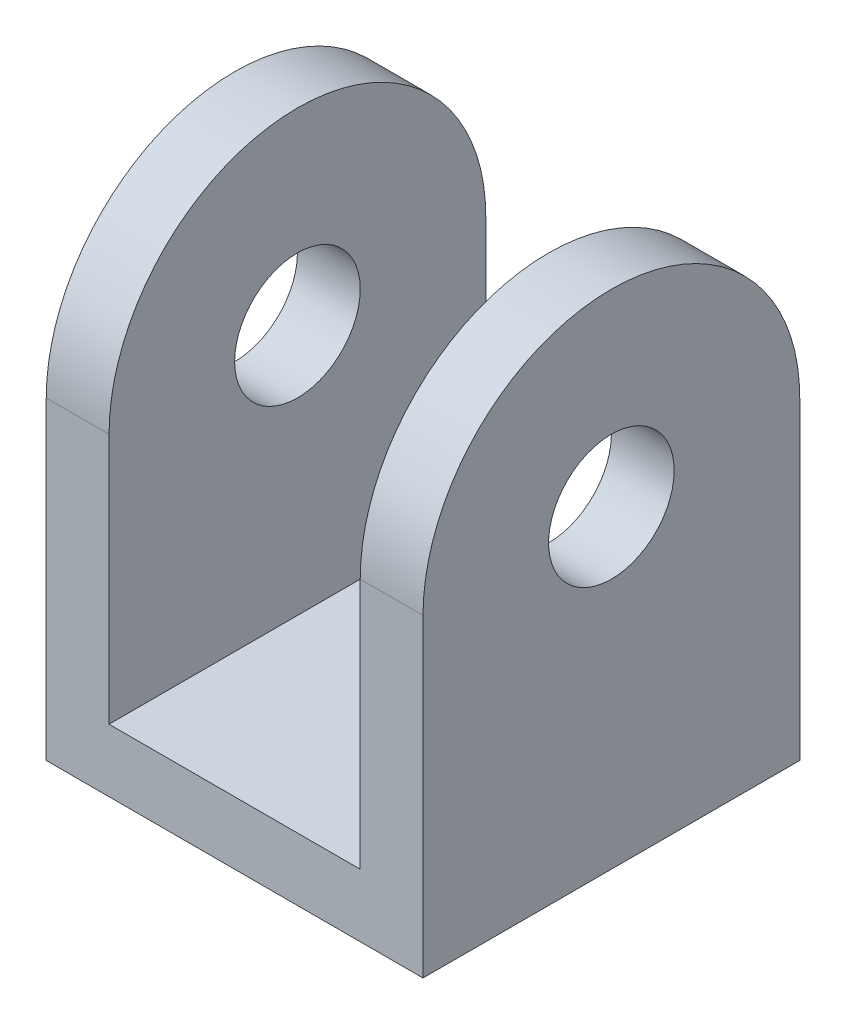
ISO-10303-21;
HEADER;
FILE_DESCRIPTION(('STEP AP214'),'2;1');
FILE_NAME('part.step','',(''),(''),'','','');
FILE_SCHEMA(('AUTOMOTIVE_DESIGN { 1 0 10303 214 1 1 1 1 }'));
ENDSEC;
DATA;
#1=APPLICATION_CONTEXT('core data for automotive mechanical design processes');
#2=APPLICATION_PROTOCOL_DEFINITION('international standard','automotive_design',2000,#1);
#3=PRODUCT_CONTEXT('',#1,'mechanical');
#4=PRODUCT('Part','Part','',(#3));
#5=PRODUCT_RELATED_PRODUCT_CATEGORY('part','',(#4));
#6=PRODUCT_DEFINITION_FORMATION('','',#4);
#7=PRODUCT_DEFINITION_CONTEXT('part definition',#1,'design');
#8=PRODUCT_DEFINITION('design','',#6,#7);
#9=PRODUCT_DEFINITION_SHAPE('','',#8);
#10=(LENGTH_UNIT() NAMED_UNIT(*) SI_UNIT(.MILLI.,.METRE.));
#11=(NAMED_UNIT(*) PLANE_ANGLE_UNIT() SI_UNIT($,.RADIAN.));
#12=(NAMED_UNIT(*) SI_UNIT($,.STERADIAN.) SOLID_ANGLE_UNIT());
#13=UNCERTAINTY_MEASURE_WITH_UNIT(LENGTH_MEASURE(1.E-05),#10,'distance_accuracy_value','');
#14=(GEOMETRIC_REPRESENTATION_CONTEXT(3) GLOBAL_UNCERTAINTY_ASSIGNED_CONTEXT((#13)) GLOBAL_UNIT_ASSIGNED_CONTEXT((#10,
#11,#12)) REPRESENTATION_CONTEXT('',''));
#15=CARTESIAN_POINT('',(0.,0.,0.));
#16=DIRECTION('',(0.,0.,1.));
#17=DIRECTION('',(1.,0.,0.));
#18=AXIS2_PLACEMENT_3D('',#15,#16,#17);
#19=CARTESIAN_POINT('',(0.,50.,30.));
#20=DIRECTION('',(1.,0.,0.));
#21=DIRECTION('',(0.,0.,-1.));
#22=AXIS2_PLACEMENT_3D('',#19,#20,#21);
#23=CYLINDRICAL_SURFACE('',#22,10.);
#24=CARTESIAN_POINT('',(10.,50.,30.));
#25=DIRECTION('',(-1.,0.,0.));
#26=DIRECTION('',(0.,0.,1.));
#27=AXIS2_PLACEMENT_3D('',#24,#25,#26);
#28=CIRCLE('',#27,10.);
#29=CARTESIAN_POINT('',(10.,50.,40.));
#30=VERTEX_POINT('',#29);
#31=EDGE_CURVE('E174',#30,#30,#28,.F.);
#32=ORIENTED_EDGE('',*,*,#31,.T.);
#33=EDGE_LOOP('',(#32));
#34=FACE_BOUND('',#33,.T.);
#35=CARTESIAN_POINT('',(0.,50.,30.));
#36=DIRECTION('',(1.,0.,0.));
#37=DIRECTION('',(0.,0.,-1.));
#38=AXIS2_PLACEMENT_3D('',#35,#36,#37);
#39=CIRCLE('',#38,10.);
#40=CARTESIAN_POINT('',(0.,50.,20.));
#41=VERTEX_POINT('',#40);
#42=EDGE_CURVE('E125',#41,#41,#39,.T.);
#43=ORIENTED_EDGE('',*,*,#42,.F.);
#44=EDGE_LOOP('',(#43));
#45=FACE_BOUND('',#44,.T.);
#46=ADVANCED_FACE('F33',(#34,#45),#23,.F.);
#47=CARTESIAN_POINT('',(60.,50.,30.));
#48=DIRECTION('',(-1.,0.,0.));
#49=DIRECTION('',(0.,0.,1.));
#50=AXIS2_PLACEMENT_3D('',#47,#48,#49);
#51=CYLINDRICAL_SURFACE('',#50,30.);
#52=CARTESIAN_POINT('',(10.,50.,30.));
#53=DIRECTION('',(-1.,0.,0.));
#54=DIRECTION('',(0.,0.,1.));
#55=AXIS2_PLACEMENT_3D('',#52,#53,#54);
#56=CIRCLE('',#55,30.);
#57=CARTESIAN_POINT('',(10.,50.,60.));
#58=VERTEX_POINT('',#57);
#59=CARTESIAN_POINT('',(10.,50.,0.));
#60=VERTEX_POINT('',#59);
#61=EDGE_CURVE('E11',#58,#60,#56,.T.);
#62=ORIENTED_EDGE('',*,*,#61,.T.);
#63=DIRECTION('',(-1.,0.,0.));
#64=VECTOR('',#63,1.);
#65=CARTESIAN_POINT('',(10.,50.,0.));
#66=LINE('',#65,#64);
#67=CARTESIAN_POINT('',(0.,50.,0.));
#68=VERTEX_POINT('',#67);
#69=EDGE_CURVE('E136',#60,#68,#66,.T.);
#70=ORIENTED_EDGE('',*,*,#69,.T.);
#71=CARTESIAN_POINT('',(0.,50.,30.));
#72=DIRECTION('',(1.,0.,0.));
#73=DIRECTION('',(0.,0.,-1.));
#74=AXIS2_PLACEMENT_3D('',#71,#72,#73);
#75=CIRCLE('',#74,30.);
#76=CARTESIAN_POINT('',(0.,50.,60.));
#77=VERTEX_POINT('',#76);
#78=EDGE_CURVE('E171',#68,#77,#75,.T.);
#79=ORIENTED_EDGE('',*,*,#78,.T.);
#80=DIRECTION('',(-1.,0.,0.));
#81=VECTOR('',#80,1.);
#82=CARTESIAN_POINT('',(10.,50.,60.));
#83=LINE('',#82,#81);
#84=EDGE_CURVE('E50',#58,#77,#83,.T.);
#85=ORIENTED_EDGE('',*,*,#84,.F.);
#86=EDGE_LOOP('',(#62,#70,#79,#85));
#87=FACE_BOUND('',#86,.T.);
#88=ADVANCED_FACE('F185',(#87),#51,.T.);
#89=CARTESIAN_POINT('',(50.,50.,60.));
#90=DIRECTION('',(1.,0.,0.));
#91=DIRECTION('',(0.,1.,0.));
#92=AXIS2_PLACEMENT_3D('',#89,#90,#91);
#93=PLANE('',#92);
#94=DIRECTION('',(0.,-1.,0.));
#95=VECTOR('',#94,1.);
#96=CARTESIAN_POINT('',(50.,50.,60.));
#97=LINE('',#96,#95);
#98=CARTESIAN_POINT('',(50.,50.,60.));
#99=VERTEX_POINT('',#98);
#100=CARTESIAN_POINT('',(50.,9.99999999999999,60.));
#101=VERTEX_POINT('',#100);
#102=EDGE_CURVE('E106',#99,#101,#97,.T.);
#103=ORIENTED_EDGE('',*,*,#102,.F.);
#104=CARTESIAN_POINT('',(50.,50.,30.));
#105=DIRECTION('',(1.,0.,0.));
#106=DIRECTION('',(0.,0.,-1.));
#107=AXIS2_PLACEMENT_3D('',#104,#105,#106);
#108=CIRCLE('',#107,30.);
#109=CARTESIAN_POINT('',(50.,50.,0.));
#110=VERTEX_POINT('',#109);
#111=EDGE_CURVE('E42',#110,#99,#108,.T.);
#112=ORIENTED_EDGE('',*,*,#111,.F.);
#113=DIRECTION('',(0.,-1.,0.));
#114=VECTOR('',#113,1.);
#115=CARTESIAN_POINT('',(50.,50.,0.));
#116=LINE('',#115,#114);
#117=CARTESIAN_POINT('',(50.,9.99999999999999,0.));
#118=VERTEX_POINT('',#117);
#119=EDGE_CURVE('E72',#110,#118,#116,.T.);
#120=ORIENTED_EDGE('',*,*,#119,.T.);
#121=DIRECTION('',(0.,0.,-1.));
#122=VECTOR('',#121,1.);
#123=CARTESIAN_POINT('',(50.,9.99999999999999,60.));
#124=LINE('',#123,#122);
#125=EDGE_CURVE('E113',#101,#118,#124,.T.);
#126=ORIENTED_EDGE('',*,*,#125,.F.);
#127=EDGE_LOOP('',(#103,#112,#120,#126));
#128=FACE_BOUND('',#127,.T.);
#129=CARTESIAN_POINT('',(50.,50.,30.));
#130=DIRECTION('',(1.,0.,0.));
#131=DIRECTION('',(0.,0.,-1.));
#132=AXIS2_PLACEMENT_3D('',#129,#130,#131);
#133=CIRCLE('',#132,10.);
#134=CARTESIAN_POINT('',(50.,50.,20.));
#135=VERTEX_POINT('',#134);
#136=EDGE_CURVE('E178',#135,#135,#133,.F.);
#137=ORIENTED_EDGE('',*,*,#136,.F.);
#138=EDGE_LOOP('',(#137));
#139=FACE_BOUND('',#138,.T.);
#140=ADVANCED_FACE('F159',(#128,#139),#93,.F.);
#141=CARTESIAN_POINT('',(10.,9.99999999999999,60.));
#142=DIRECTION('',(-1.,0.,0.));
#143=DIRECTION('',(0.,-1.,0.));
#144=AXIS2_PLACEMENT_3D('',#141,#142,#143);
#145=PLANE('',#144);
#146=DIRECTION('',(0.,1.,0.));
#147=VECTOR('',#146,1.);
#148=CARTESIAN_POINT('',(10.,9.99999999999999,0.));
#149=LINE('',#148,#147);
#150=CARTESIAN_POINT('',(10.,9.99999999999999,0.));
#151=VERTEX_POINT('',#150);
#152=EDGE_CURVE('E134',#151,#60,#149,.T.);
#153=ORIENTED_EDGE('',*,*,#152,.T.);
#154=ORIENTED_EDGE('',*,*,#61,.F.);
#155=DIRECTION('',(0.,1.,0.));
#156=VECTOR('',#155,1.);
#157=CARTESIAN_POINT('',(10.,9.99999999999999,60.));
#158=LINE('',#157,#156);
#159=CARTESIAN_POINT('',(10.,9.99999999999999,60.));
#160=VERTEX_POINT('',#159);
#161=EDGE_CURVE('E103',#160,#58,#158,.T.);
#162=ORIENTED_EDGE('',*,*,#161,.F.);
#163=DIRECTION('',(0.,0.,-1.));
#164=VECTOR('',#163,1.);
#165=CARTESIAN_POINT('',(10.,9.99999999999999,60.));
#166=LINE('',#165,#164);
#167=EDGE_CURVE('E108',#160,#151,#166,.T.);
#168=ORIENTED_EDGE('',*,*,#167,.T.);
#169=EDGE_LOOP('',(#153,#154,#162,#168));
#170=FACE_BOUND('',#169,.T.);
#171=ORIENTED_EDGE('',*,*,#31,.F.);
#172=EDGE_LOOP('',(#171));
#173=FACE_BOUND('',#172,.T.);
#174=ADVANCED_FACE('F115',(#170,#173),#145,.F.);
#175=CARTESIAN_POINT('',(0.,50.,60.));
#176=DIRECTION('',(1.,0.,0.));
#177=DIRECTION('',(0.,0.,-1.));
#178=AXIS2_PLACEMENT_3D('',#175,#176,#177);
#179=PLANE('',#178);
#180=ORIENTED_EDGE('',*,*,#78,.F.);
#181=DIRECTION('',(0.,-1.,0.));
#182=VECTOR('',#181,1.);
#183=CARTESIAN_POINT('',(0.,50.,0.));
#184=LINE('',#183,#182);
#185=CARTESIAN_POINT('',(0.,0.,0.));
#186=VERTEX_POINT('',#185);
#187=EDGE_CURVE('E121',#68,#186,#184,.T.);
#188=ORIENTED_EDGE('',*,*,#187,.T.);
#189=DIRECTION('',(0.,0.,-1.));
#190=VECTOR('',#189,1.);
#191=CARTESIAN_POINT('',(0.,0.,60.));
#192=LINE('',#191,#190);
#193=CARTESIAN_POINT('',(0.,0.,60.));
#194=VERTEX_POINT('',#193);
#195=EDGE_CURVE('E144',#194,#186,#192,.T.);
#196=ORIENTED_EDGE('',*,*,#195,.F.);
#197=DIRECTION('',(0.,-1.,0.));
#198=VECTOR('',#197,1.);
#199=CARTESIAN_POINT('',(0.,50.,60.));
#200=LINE('',#199,#198);
#201=EDGE_CURVE('E138',#77,#194,#200,.T.);
#202=ORIENTED_EDGE('',*,*,#201,.F.);
#203=EDGE_LOOP('',(#180,#188,#196,#202));
#204=FACE_BOUND('',#203,.T.);
#205=ORIENTED_EDGE('',*,*,#42,.T.);
#206=EDGE_LOOP('',(#205));
#207=FACE_BOUND('',#206,.T.);
#208=ADVANCED_FACE('F35',(#204,#207),#179,.F.);
#209=CARTESIAN_POINT('',(0.,0.,60.));
#210=DIRECTION('',(0.,1.,0.));
#211=DIRECTION('',(0.,0.,1.));
#212=AXIS2_PLACEMENT_3D('',#209,#210,#211);
#213=PLANE('',#212);
#214=DIRECTION('',(1.,0.,0.));
#215=VECTOR('',#214,1.);
#216=CARTESIAN_POINT('',(0.,0.,0.));
#217=LINE('',#216,#215);
#218=CARTESIAN_POINT('',(60.,0.,0.));
#219=VERTEX_POINT('',#218);
#220=EDGE_CURVE('E124',#186,#219,#217,.T.);
#221=ORIENTED_EDGE('',*,*,#220,.T.);
#222=DIRECTION('',(0.,0.,-1.));
#223=VECTOR('',#222,1.);
#224=CARTESIAN_POINT('',(60.,0.,60.));
#225=LINE('',#224,#223);
#226=CARTESIAN_POINT('',(60.,0.,60.));
#227=VERTEX_POINT('',#226);
#228=EDGE_CURVE('E141',#227,#219,#225,.T.);
#229=ORIENTED_EDGE('',*,*,#228,.F.);
#230=DIRECTION('',(1.,0.,0.));
#231=VECTOR('',#230,1.);
#232=CARTESIAN_POINT('',(0.,0.,60.));
#233=LINE('',#232,#231);
#234=EDGE_CURVE('E88',#194,#227,#233,.T.);
#235=ORIENTED_EDGE('',*,*,#234,.F.);
#236=ORIENTED_EDGE('',*,*,#195,.T.);
#237=EDGE_LOOP('',(#221,#229,#235,#236));
#238=FACE_BOUND('',#237,.T.);
#239=ADVANCED_FACE('F220',(#238),#213,.F.);
#240=CARTESIAN_POINT('',(60.,0.,60.));
#241=DIRECTION('',(-1.,0.,0.));
#242=DIRECTION('',(0.,0.,1.));
#243=AXIS2_PLACEMENT_3D('',#240,#241,#242);
#244=PLANE('',#243);
#245=DIRECTION('',(0.,1.,0.));
#246=VECTOR('',#245,1.);
#247=CARTESIAN_POINT('',(60.,0.,0.));
#248=LINE('',#247,#246);
#249=CARTESIAN_POINT('',(60.,50.,0.));
#250=VERTEX_POINT('',#249);
#251=EDGE_CURVE('E127',#219,#250,#248,.T.);
#252=ORIENTED_EDGE('',*,*,#251,.T.);
#253=CARTESIAN_POINT('',(60.,50.,30.));
#254=DIRECTION('',(1.,0.,0.));
#255=DIRECTION('',(0.,0.,-1.));
#256=AXIS2_PLACEMENT_3D('',#253,#254,#255);
#257=CIRCLE('',#256,30.);
#258=CARTESIAN_POINT('',(60.,50.,60.));
#259=VERTEX_POINT('',#258);
#260=EDGE_CURVE('E168',#250,#259,#257,.T.);
#261=ORIENTED_EDGE('',*,*,#260,.T.);
#262=DIRECTION('',(0.,1.,0.));
#263=VECTOR('',#262,1.);
#264=CARTESIAN_POINT('',(60.,0.,60.));
#265=LINE('',#264,#263);
#266=EDGE_CURVE('E157',#227,#259,#265,.T.);
#267=ORIENTED_EDGE('',*,*,#266,.F.);
#268=ORIENTED_EDGE('',*,*,#228,.T.);
#269=EDGE_LOOP('',(#252,#261,#267,#268));
#270=FACE_BOUND('',#269,.T.);
#271=CARTESIAN_POINT('',(60.,50.,30.));
#272=DIRECTION('',(1.,0.,0.));
#273=DIRECTION('',(0.,0.,-1.));
#274=AXIS2_PLACEMENT_3D('',#271,#272,#273);
#275=CIRCLE('',#274,10.);
#276=CARTESIAN_POINT('',(60.,50.,20.));
#277=VERTEX_POINT('',#276);
#278=EDGE_CURVE('E165',#277,#277,#275,.T.);
#279=ORIENTED_EDGE('',*,*,#278,.F.);
#280=EDGE_LOOP('',(#279));
#281=FACE_BOUND('',#280,.T.);
#282=ADVANCED_FACE('F216',(#270,#281),#244,.F.);
#283=CARTESIAN_POINT('',(50.,9.99999999999999,60.));
#284=DIRECTION('',(0.,-1.,0.));
#285=DIRECTION('',(1.,0.,0.));
#286=AXIS2_PLACEMENT_3D('',#283,#284,#285);
#287=PLANE('',#286);
#288=DIRECTION('',(-1.,0.,0.));
#289=VECTOR('',#288,1.);
#290=CARTESIAN_POINT('',(50.,9.99999999999999,0.));
#291=LINE('',#290,#289);
#292=EDGE_CURVE('E79',#118,#151,#291,.T.);
#293=ORIENTED_EDGE('',*,*,#292,.T.);
#294=ORIENTED_EDGE('',*,*,#167,.F.);
#295=DIRECTION('',(-1.,0.,0.));
#296=VECTOR('',#295,1.);
#297=CARTESIAN_POINT('',(50.,9.99999999999999,60.));
#298=LINE('',#297,#296);
#299=EDGE_CURVE('E100',#101,#160,#298,.T.);
#300=ORIENTED_EDGE('',*,*,#299,.F.);
#301=ORIENTED_EDGE('',*,*,#125,.T.);
#302=EDGE_LOOP('',(#293,#294,#300,#301));
#303=FACE_BOUND('',#302,.T.);
#304=ADVANCED_FACE('F109',(#303),#287,.F.);
#305=CARTESIAN_POINT('',(0.,0.,60.));
#306=DIRECTION('',(0.,0.,1.));
#307=DIRECTION('',(1.,0.,0.));
#308=AXIS2_PLACEMENT_3D('',#305,#306,#307);
#309=PLANE('',#308);
#310=ORIENTED_EDGE('',*,*,#201,.T.);
#311=ORIENTED_EDGE('',*,*,#234,.T.);
#312=ORIENTED_EDGE('',*,*,#266,.T.);
#313=DIRECTION('',(-1.,0.,0.));
#314=VECTOR('',#313,1.);
#315=CARTESIAN_POINT('',(60.,50.,60.));
#316=LINE('',#315,#314);
#317=EDGE_CURVE('E151',#259,#99,#316,.T.);
#318=ORIENTED_EDGE('',*,*,#317,.T.);
#319=ORIENTED_EDGE('',*,*,#102,.T.);
#320=ORIENTED_EDGE('',*,*,#299,.T.);
#321=ORIENTED_EDGE('',*,*,#161,.T.);
#322=ORIENTED_EDGE('',*,*,#84,.T.);
#323=EDGE_LOOP('',(#310,#311,#312,#318,#319,#320,#321,#322));
#324=FACE_BOUND('',#323,.T.);
#325=ADVANCED_FACE('F101',(#324),#309,.T.);
#326=CARTESIAN_POINT('',(0.,0.,0.));
#327=DIRECTION('',(0.,0.,1.));
#328=DIRECTION('',(1.,0.,0.));
#329=AXIS2_PLACEMENT_3D('',#326,#327,#328);
#330=PLANE('',#329);
#331=ORIENTED_EDGE('',*,*,#187,.F.);
#332=ORIENTED_EDGE('',*,*,#69,.F.);
#333=ORIENTED_EDGE('',*,*,#152,.F.);
#334=ORIENTED_EDGE('',*,*,#292,.F.);
#335=ORIENTED_EDGE('',*,*,#119,.F.);
#336=DIRECTION('',(-1.,0.,0.));
#337=VECTOR('',#336,1.);
#338=CARTESIAN_POINT('',(60.,50.,0.));
#339=LINE('',#338,#337);
#340=EDGE_CURVE('E129',#250,#110,#339,.T.);
#341=ORIENTED_EDGE('',*,*,#340,.F.);
#342=ORIENTED_EDGE('',*,*,#251,.F.);
#343=ORIENTED_EDGE('',*,*,#220,.F.);
#344=EDGE_LOOP('',(#331,#332,#333,#334,#335,#341,#342,#343));
#345=FACE_BOUND('',#344,.T.);
#346=ADVANCED_FACE('F204',(#345),#330,.F.);
#347=ORIENTED_EDGE('',*,*,#136,.T.);
#348=EDGE_LOOP('',(#347));
#349=FACE_BOUND('',#348,.T.);
#350=ORIENTED_EDGE('',*,*,#278,.T.);
#351=EDGE_LOOP('',(#350));
#352=FACE_BOUND('',#351,.T.);
#353=ADVANCED_FACE('F182',(#349,#352),#23,.F.);
#354=ORIENTED_EDGE('',*,*,#340,.T.);
#355=ORIENTED_EDGE('',*,*,#111,.T.);
#356=ORIENTED_EDGE('',*,*,#317,.F.);
#357=ORIENTED_EDGE('',*,*,#260,.F.);
#358=EDGE_LOOP('',(#354,#355,#356,#357));
#359=FACE_BOUND('',#358,.T.);
#360=ADVANCED_FACE('F149',(#359),#51,.T.);
#361=CLOSED_SHELL('',(#46,#88,#140,#174,#208,#239,#282,#304,#325,#346,#353,#360));
#362=MANIFOLD_SOLID_BREP('B2',#361);
#363=ADVANCED_BREP_SHAPE_REPRESENTATION('',(#18,#362),#14);
#364=SHAPE_DEFINITION_REPRESENTATION(#9,#363);
ENDSEC;
END-ISO-10303-21;
